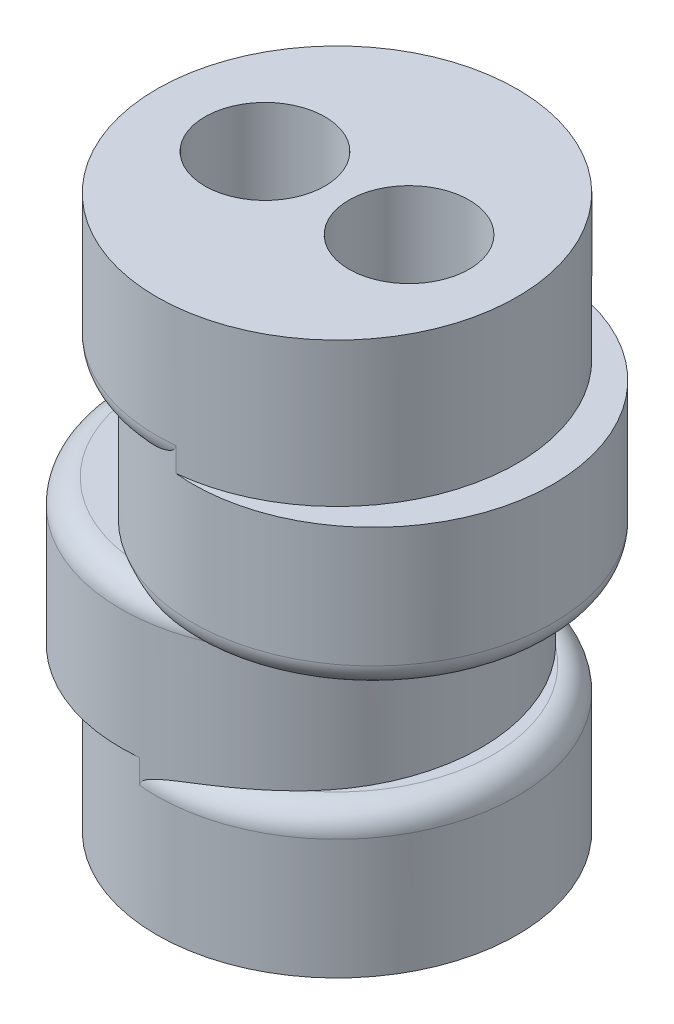
ISO-10303-21;
HEADER;
FILE_DESCRIPTION(('STEP AP214'),'2;1');
FILE_NAME('part.step','',(''),(''),'','','');
FILE_SCHEMA(('AUTOMOTIVE_DESIGN { 1 0 10303 214 1 1 1 1 }'));
ENDSEC;
DATA;
#1=APPLICATION_CONTEXT('core data for automotive mechanical design processes');
#2=APPLICATION_PROTOCOL_DEFINITION('international standard','automotive_design',2000,#1);
#3=PRODUCT_CONTEXT('',#1,'mechanical');
#4=PRODUCT('Part','Part','',(#3));
#5=PRODUCT_RELATED_PRODUCT_CATEGORY('part','',(#4));
#6=PRODUCT_DEFINITION_FORMATION('','',#4);
#7=PRODUCT_DEFINITION_CONTEXT('part definition',#1,'design');
#8=PRODUCT_DEFINITION('design','',#6,#7);
#9=PRODUCT_DEFINITION_SHAPE('','',#8);
#10=(LENGTH_UNIT() NAMED_UNIT(*) SI_UNIT(.MILLI.,.METRE.));
#11=(NAMED_UNIT(*) PLANE_ANGLE_UNIT() SI_UNIT($,.RADIAN.));
#12=(NAMED_UNIT(*) SI_UNIT($,.STERADIAN.) SOLID_ANGLE_UNIT());
#13=UNCERTAINTY_MEASURE_WITH_UNIT(LENGTH_MEASURE(1.E-05),#10,'distance_accuracy_value','');
#14=(GEOMETRIC_REPRESENTATION_CONTEXT(3) GLOBAL_UNCERTAINTY_ASSIGNED_CONTEXT((#13)) GLOBAL_UNIT_ASSIGNED_CONTEXT((#10,
#11,#12)) REPRESENTATION_CONTEXT('',''));
#15=CARTESIAN_POINT('',(0.,0.,0.));
#16=DIRECTION('',(0.,0.,1.));
#17=DIRECTION('',(1.,0.,0.));
#18=AXIS2_PLACEMENT_3D('',#15,#16,#17);
#19=CARTESIAN_POINT('',(0.,1.,0.));
#20=DIRECTION('',(0.,1.,0.));
#21=DIRECTION('',(0.,0.,1.));
#22=AXIS2_PLACEMENT_3D('',#19,#20,#21);
#23=PLANE('',#22);
#24=CARTESIAN_POINT('',(1.5,1.,0.));
#25=DIRECTION('',(0.,1.,0.));
#26=DIRECTION('',(0.,0.,1.));
#27=AXIS2_PLACEMENT_3D('',#24,#25,#26);
#28=CIRCLE('',#27,7.5);
#29=CARTESIAN_POINT('',(-2.33333333333333,1.,-6.44635986860457));
#30=VERTEX_POINT('',#29);
#31=CARTESIAN_POINT('',(-2.33333333333334,1.,6.44635986860457));
#32=VERTEX_POINT('',#31);
#33=EDGE_CURVE('E114',#30,#32,#28,.T.);
#34=ORIENTED_EDGE('',*,*,#33,.F.);
#35=CARTESIAN_POINT('',(-1.5,1.,0.));
#36=DIRECTION('',(0.,1.,0.));
#37=DIRECTION('',(0.,0.,1.));
#38=AXIS2_PLACEMENT_3D('',#35,#36,#37);
#39=CIRCLE('',#38,6.5);
#40=EDGE_CURVE('E124',#30,#32,#39,.T.);
#41=ORIENTED_EDGE('',*,*,#40,.T.);
#42=EDGE_LOOP('',(#34,#41));
#43=FACE_BOUND('',#42,.T.);
#44=ADVANCED_FACE('F43',(#43),#23,.T.);
#45=CARTESIAN_POINT('',(1.5,6.,0.));
#46=DIRECTION('',(0.,-1.,0.));
#47=DIRECTION('',(0.,0.,-1.));
#48=AXIS2_PLACEMENT_3D('',#45,#46,#47);
#49=CYLINDRICAL_SURFACE('',#48,7.5);
#50=CARTESIAN_POINT('',(1.5,6.,0.));
#51=DIRECTION('',(0.,1.,0.));
#52=DIRECTION('',(0.,0.,1.));
#53=AXIS2_PLACEMENT_3D('',#50,#51,#52);
#54=CIRCLE('',#53,7.5);
#55=CARTESIAN_POINT('',(-3.91666666666667,6.,-5.18745816582863));
#56=VERTEX_POINT('',#55);
#57=CARTESIAN_POINT('',(-3.91666666666667,6.,5.18745816582863));
#58=VERTEX_POINT('',#57);
#59=EDGE_CURVE('E126',#56,#58,#54,.T.);
#60=ORIENTED_EDGE('',*,*,#59,.F.);
#61=CARTESIAN_POINT('',(-3.91666666666667,6.,-5.18745816582863));
#62=CARTESIAN_POINT('',(-3.80020965298497,6.00000376623683,-5.30907745682028));
#63=CARTESIAN_POINT('',(-3.67963772504321,6.00108425668644,-5.42676221345615));
#64=CARTESIAN_POINT('',(-3.4308604372146,6.00579596257565,-5.65375342871365));
#65=CARTESIAN_POINT('',(-3.30265380357124,6.00942760474079,-5.76305848228776));
#66=CARTESIAN_POINT('',(-3.03857688571664,6.01966497350277,-5.97327016206557));
#67=CARTESIAN_POINT('',(-2.90267112692783,6.02628564632135,-6.074131524888));
#68=CARTESIAN_POINT('',(-2.62450920628984,6.04296113263224,-6.26633830271847));
#69=CARTESIAN_POINT('',(-2.48225373346395,6.05301557430147,-6.35768474664537));
#70=CARTESIAN_POINT('',(-2.19201443519067,6.07711740261451,-6.53051171759557));
#71=CARTESIAN_POINT('',(-2.04402547613502,6.09116844257409,-6.61198312015529));
#72=CARTESIAN_POINT('',(-1.7432570506047,6.12397818330012,-6.76459326921122));
#73=CARTESIAN_POINT('',(-1.59047632801145,6.14273812764413,-6.83572927837934));
#74=CARTESIAN_POINT('',(-1.28167539426653,6.18593141537546,-6.96709052071892));
#75=CARTESIAN_POINT('',(-1.12566746598823,6.21034592950186,-7.02735080959187));
#76=CARTESIAN_POINT('',(-0.811208030710873,6.26646658636996,-7.13694445746253));
#77=CARTESIAN_POINT('',(-0.652758445892802,6.29816724188823,-7.186285984813));
#78=CARTESIAN_POINT('',(-0.420906466500022,6.35210082719847,-7.25023370801776));
#79=CARTESIAN_POINT('',(-0.347730652853794,6.37021733834268,-7.26922016067236));
#80=CARTESIAN_POINT('',(-0.201572565759272,6.40923541251192,-7.30481314091101));
#81=CARTESIAN_POINT('',(-0.12859020419728,6.43013534176396,-7.32142105284015));
#82=CARTESIAN_POINT('',(-0.00523888297090668,6.46872045224718,-7.34758084829485));
#83=CARTESIAN_POINT('',(0.0452936294616805,6.48546620764322,-7.35774763888258));
#84=CARTESIAN_POINT('',(0.145777049732081,6.52121136616641,-7.3769025460988));
#85=CARTESIAN_POINT('',(0.195728147423861,6.54021000959945,-7.38589105791297));
#86=CARTESIAN_POINT('',(0.292551650967351,6.5803548726076,-7.40232268605764));
#87=CARTESIAN_POINT('',(0.339465887243796,6.60137957306734,-7.40981438583232));
#88=CARTESIAN_POINT('',(0.431592455582759,6.64725385341274,-7.42365517215394));
#89=CARTESIAN_POINT('',(0.476806590617029,6.67209923040398,-7.43000549780786));
#90=CARTESIAN_POINT('',(0.543212037994136,6.71459715050666,-7.43875664565825));
#91=CARTESIAN_POINT('',(0.565690108693779,6.73012785380337,-7.44160917944584));
#92=CARTESIAN_POINT('',(0.609054208703472,6.76339299717483,-7.44692472083518));
#93=CARTESIAN_POINT('',(0.629940714335985,6.78112677370304,-7.44938784521816));
#94=CARTESIAN_POINT('',(0.66287298456048,6.81354047508802,-7.45314719094539));
#95=CARTESIAN_POINT('',(0.675648319407143,6.82745542569204,-7.45456810646068));
#96=CARTESIAN_POINT('',(0.699170787590578,6.85694899111191,-7.45713156426466));
#97=CARTESIAN_POINT('',(0.709921871752992,6.87252427029394,-7.45827465010285));
#98=CARTESIAN_POINT('',(0.725358794780123,6.90019071807877,-7.45989083400088));
#99=CARTESIAN_POINT('',(0.730884638625262,6.91180219183627,-7.46046127899173));
#100=CARTESIAN_POINT('',(0.740027558581135,6.93574811465664,-7.46139820668603));
#101=CARTESIAN_POINT('',(0.743650811839134,6.94808007774894,-7.46176534966521));
#102=CARTESIAN_POINT('',(0.747399345858202,6.96710387040428,-7.46214405337588));
#103=CARTESIAN_POINT('',(0.748368871042657,6.97363359720126,-7.46224171047334));
#104=CARTESIAN_POINT('',(0.749671499278991,6.98677382505067,-7.46237276621829));
#105=CARTESIAN_POINT('',(0.750002925466697,6.99338449311085,-7.46240599555728));
#106=CARTESIAN_POINT('',(0.749999999999993,7.,-7.46240577829976));
#107=B_SPLINE_CURVE_WITH_KNOTS('',3,(#61,#62,#63,#64,#65,#66,#67,#68,#69,#70,#71,#72,#73,#74,
#75,#76,#77,#78,#79,#80,#81,#82,#83,#84,#85,#86,#87,#88,#89,#90,#91,#92,#93,#94,#95,#96,#97,#98,
#99,#100,#101,#102,#103,#104,#105,#106),.UNSPECIFIED.,.F.,.F.,(4,2,2,2,2,2,2,2,2,2,2,2,2,2,2,2,
2,2,2,2,2,2,4),(0.,0.505062255120316,1.01020901101779,1.51791014782438,2.02555632601417,
2.53366804638759,3.04191409574927,3.54849145973945,4.05468856105465,4.28784439163478,
4.52086396582719,4.68340962729234,4.84590063193817,5.00166247624181,5.15725418616227,
5.23958196319817,5.32188500366811,5.37859702517834,5.43519718498234,5.47368789833394,
5.51205285878407,5.53183036461231,5.55165977330438),.UNSPECIFIED.);
#108=CARTESIAN_POINT('',(0.749999999999996,7.,-7.46240577829965));
#109=VERTEX_POINT('',#108);
#110=EDGE_CURVE('E180',#56,#109,#107,.T.);
#111=ORIENTED_EDGE('',*,*,#110,.T.);
#112=DIRECTION('',(0.,-1.,0.));
#113=VECTOR('',#112,1.);
#114=CARTESIAN_POINT('',(0.749999999999996,6.,-7.46240577829965));
#115=LINE('',#114,#113);
#116=CARTESIAN_POINT('',(0.749999999999996,6.,-7.46240577829965));
#117=VERTEX_POINT('',#116);
#118=EDGE_CURVE('E137',#117,#109,#115,.F.);
#119=ORIENTED_EDGE('',*,*,#118,.F.);
#120=CARTESIAN_POINT('',(0.749999999999996,6.,7.46240577829965));
#121=VERTEX_POINT('',#120);
#122=EDGE_CURVE('E224',#121,#117,#54,.T.);
#123=ORIENTED_EDGE('',*,*,#122,.F.);
#124=DIRECTION('',(0.,-1.,0.));
#125=VECTOR('',#124,1.);
#126=CARTESIAN_POINT('',(0.749999999999996,7.,7.46240577829965));
#127=LINE('',#126,#125);
#128=CARTESIAN_POINT('',(0.749999999999996,7.,7.46240577829965));
#129=VERTEX_POINT('',#128);
#130=EDGE_CURVE('E219',#129,#121,#127,.T.);
#131=ORIENTED_EDGE('',*,*,#130,.F.);
#132=CARTESIAN_POINT('',(0.749999999999996,7.,7.46240577829965));
#133=CARTESIAN_POINT('',(0.750036019482423,6.98768932188069,7.46240858779575));
#134=CARTESIAN_POINT('',(0.748864907845315,6.97542836613851,7.46229174037365));
#135=CARTESIAN_POINT('',(0.744449600849435,6.95144863789059,7.46184638454914));
#136=CARTESIAN_POINT('',(0.741232817086053,6.93972486130516,7.46152067439013));
#137=CARTESIAN_POINT('',(0.731789701152738,6.91340717841082,7.46055493361893));
#138=CARTESIAN_POINT('',(0.724941054314432,6.89904368994116,7.45984893177615));
#139=CARTESIAN_POINT('',(0.70907200046839,6.87152552217409,7.4581832747781));
#140=CARTESIAN_POINT('',(0.70003888331614,6.85837856401737,7.4572221317859));
#141=CARTESIAN_POINT('',(0.672769264161954,6.82335194120346,7.45426009423984));
#142=CARTESIAN_POINT('',(0.652900834498436,6.80278125236648,7.45203775657896));
#143=CARTESIAN_POINT('',(0.61065685982178,6.76454143185731,7.44711551322688));
#144=CARTESIAN_POINT('',(0.588275404376113,6.74687939211076,7.44441447266344));
#145=CARTESIAN_POINT('',(0.528610154578932,6.70404836596634,7.43691801358863));
#146=CARTESIAN_POINT('',(0.490226294690102,6.68048347691626,7.43181781775912));
#147=CARTESIAN_POINT('',(0.411613003473146,6.63685628307404,7.42071468483683));
#148=CARTESIAN_POINT('',(0.371379380986006,6.61680248296643,7.41470961959176));
#149=CARTESIAN_POINT('',(0.289661294193137,6.57915123944664,7.40181052893364));
#150=CARTESIAN_POINT('',(0.248171308973287,6.5615674481193,7.39491193905075));
#151=CARTESIAN_POINT('',(0.164616128968209,6.52838421448956,7.38028116134549));
#152=CARTESIAN_POINT('',(0.122551602447707,6.51278265356899,7.37254988012521));
#153=CARTESIAN_POINT('',(0.0119150730710967,6.4739591647081,7.35122075828593));
#154=CARTESIAN_POINT('',(-0.0569667792543377,6.45198935209197,7.33695106064973));
#155=CARTESIAN_POINT('',(-0.195147474584635,6.4110380131887,7.30626419042599));
#156=CARTESIAN_POINT('',(-0.264446476427024,6.39205771121021,7.28984614302765));
#157=CARTESIAN_POINT('',(-0.472641578898537,6.3385628275698,7.23734504048204));
#158=CARTESIAN_POINT('',(-0.611642187400639,6.30755715980983,7.19805200278103));
#159=CARTESIAN_POINT('',(-0.888238050376488,6.25202987076969,7.11107368128666));
#160=CARTESIAN_POINT('',(-1.0258333735579,6.22750793101188,7.06338880988791));
#161=CARTESIAN_POINT('',(-1.2986040208593,6.18350714460653,6.95981932665844));
#162=CARTESIAN_POINT('',(-1.43378092411331,6.16402488636892,6.90394030218513));
#163=CARTESIAN_POINT('',(-1.7486646332577,6.12293676049248,6.76281050571334));
#164=CARTESIAN_POINT('',(-1.92709234595917,6.1030439819635,6.67418526728801));
#165=CARTESIAN_POINT('',(-2.2768365560345,6.06929161782035,6.48269158112197));
#166=CARTESIAN_POINT('',(-2.44814889342681,6.05543551783484,6.37981494956751));
#167=CARTESIAN_POINT('',(-2.78196239366293,6.03279059830429,6.16073002643345));
#168=CARTESIAN_POINT('',(-2.94447755328891,6.02399350129286,6.04454388743313));
#169=CARTESIAN_POINT('',(-3.25974024293427,6.01065483432667,5.79954218078066));
#170=CARTESIAN_POINT('',(-3.41249395190806,6.00611054699621,5.67073473585044));
#171=CARTESIAN_POINT('',(-3.6212702548127,6.00220428186261,5.47992009148906));
#172=CARTESIAN_POINT('',(-3.68175680686078,6.00136558665078,5.42275982968774));
#173=CARTESIAN_POINT('',(-3.80071298276317,6.00026392263928,5.30653777701674));
#174=CARTESIAN_POINT('',(-3.8591853377709,6.00000014139165,5.24747878936676));
#175=CARTESIAN_POINT('',(-3.91666666666667,6.,5.18745816582863));
#176=B_SPLINE_CURVE_WITH_KNOTS('',3,(#132,#133,#134,#135,#136,#137,#138,#139,#140,#141,#142,
#143,#144,#145,#146,#147,#148,#149,#150,#151,#152,#153,#154,#155,#156,#157,#158,#159,#160,#161,
#162,#163,#164,#165,#166,#167,#168,#169,#170,#171,#172,#173,#174,#175),.UNSPECIFIED.,.F.,.F.,(4,
2,2,2,2,2,2,2,2,2,2,2,2,2,2,2,2,2,2,2,2,4),(0.,0.0367957490978329,0.0731085429829649,
0.120624455101134,0.168423783228875,0.253995683915516,0.339773233848797,0.475411370943238,
0.611373642032931,0.748060082676455,0.884599180690596,1.10555328151241,1.32659763675717,
1.76930477204746,2.21199015773085,2.65437508061259,3.2542486811862,3.8544681962086,
4.4537028260649,5.05255430695963,5.30219462134304,5.5514819235587),.UNSPECIFIED.);
#177=EDGE_CURVE('E173',#129,#58,#176,.T.);
#178=ORIENTED_EDGE('',*,*,#177,.T.);
#179=EDGE_LOOP('',(#60,#111,#119,#123,#131,#178));
#180=FACE_BOUND('',#179,.T.);
#181=ORIENTED_EDGE('',*,*,#33,.T.);
#182=CARTESIAN_POINT('',(1.5,1.,0.));
#183=DIRECTION('',(0.,1.,0.));
#184=DIRECTION('',(0.,0.,1.));
#185=AXIS2_PLACEMENT_3D('',#182,#183,#184);
#186=CIRCLE('',#185,7.5);
#187=EDGE_CURVE('E111',#32,#30,#186,.T.);
#188=ORIENTED_EDGE('',*,*,#187,.T.);
#189=EDGE_LOOP('',(#181,#188));
#190=FACE_BOUND('',#189,.T.);
#191=ADVANCED_FACE('F113',(#180,#190),#49,.T.);
#192=CARTESIAN_POINT('',(0.,6.,0.));
#193=DIRECTION('',(0.,1.,0.));
#194=DIRECTION('',(0.,0.,1.));
#195=AXIS2_PLACEMENT_3D('',#192,#193,#194);
#196=PLANE('',#195);
#197=CARTESIAN_POINT('',(0.,6.,0.));
#198=DIRECTION('',(0.,1.,0.));
#199=DIRECTION('',(0.,0.,1.));
#200=AXIS2_PLACEMENT_3D('',#197,#198,#199);
#201=CIRCLE('',#200,7.5);
#202=EDGE_CURVE('E216',#121,#117,#201,.T.);
#203=ORIENTED_EDGE('',*,*,#202,.F.);
#204=ORIENTED_EDGE('',*,*,#122,.T.);
#205=EDGE_LOOP('',(#203,#204));
#206=FACE_BOUND('',#205,.T.);
#207=ADVANCED_FACE('F169',(#206),#196,.T.);
#208=CARTESIAN_POINT('',(0.,-5.,0.));
#209=DIRECTION('',(0.,-1.,0.));
#210=DIRECTION('',(0.,0.,-1.));
#211=AXIS2_PLACEMENT_3D('',#208,#209,#210);
#212=PLANE('',#211);
#213=CARTESIAN_POINT('',(-1.5,-5.,0.));
#214=DIRECTION('',(0.,-1.,0.));
#215=DIRECTION('',(0.,0.,-1.));
#216=AXIS2_PLACEMENT_3D('',#213,#214,#215);
#217=CIRCLE('',#216,7.5);
#218=CARTESIAN_POINT('',(-0.750000000000001,-5.,7.46240577829965));
#219=VERTEX_POINT('',#218);
#220=CARTESIAN_POINT('',(-0.749999999999999,-5.,-7.46240577829965));
#221=VERTEX_POINT('',#220);
#222=EDGE_CURVE('E228',#219,#221,#217,.T.);
#223=ORIENTED_EDGE('',*,*,#222,.T.);
#224=CARTESIAN_POINT('',(0.,-5.,0.));
#225=DIRECTION('',(0.,1.,0.));
#226=DIRECTION('',(0.,0.,1.));
#227=AXIS2_PLACEMENT_3D('',#224,#225,#226);
#228=CIRCLE('',#227,7.5);
#229=EDGE_CURVE('E262',#221,#219,#228,.T.);
#230=ORIENTED_EDGE('',*,*,#229,.T.);
#231=EDGE_LOOP('',(#223,#230));
#232=FACE_BOUND('',#231,.T.);
#233=ADVANCED_FACE('F237',(#232),#212,.T.);
#234=CARTESIAN_POINT('',(-1.5,-5.,0.));
#235=DIRECTION('',(0.,1.,0.));
#236=DIRECTION('',(0.,0.,1.));
#237=AXIS2_PLACEMENT_3D('',#234,#235,#236);
#238=CYLINDRICAL_SURFACE('',#237,7.5);
#239=CARTESIAN_POINT('',(3.91666666666667,-5.,-5.18745816582864));
#240=VERTEX_POINT('',#239);
#241=CARTESIAN_POINT('',(3.91666666666667,-5.,5.18745816582864));
#242=VERTEX_POINT('',#241);
#243=EDGE_CURVE('E225',#240,#242,#217,.T.);
#244=ORIENTED_EDGE('',*,*,#243,.F.);
#245=CARTESIAN_POINT('',(3.91666666666667,-5.,-5.18745816582864));
#246=CARTESIAN_POINT('',(3.80020965298496,-5.00000376623683,-5.30907745682028));
#247=CARTESIAN_POINT('',(3.67963772504321,-5.00108425668644,-5.42676221345615));
#248=CARTESIAN_POINT('',(3.43086043721459,-5.00579596257565,-5.65375342871366));
#249=CARTESIAN_POINT('',(3.30265380357123,-5.00942760474079,-5.76305848228776));
#250=CARTESIAN_POINT('',(3.03857688571663,-5.01966497350277,-5.97327016206557));
#251=CARTESIAN_POINT('',(2.90267112692783,-5.02628564632135,-6.074131524888));
#252=CARTESIAN_POINT('',(2.62450920628984,-5.04296113263224,-6.26633830271847));
#253=CARTESIAN_POINT('',(2.48225373346395,-5.05301557430147,-6.35768474664537));
#254=CARTESIAN_POINT('',(2.19201443519067,-5.07711740261451,-6.53051171759557));
#255=CARTESIAN_POINT('',(2.04402547613501,-5.09116844257409,-6.6119831201553));
#256=CARTESIAN_POINT('',(1.74325705060469,-5.12397818330012,-6.76459326921122));
#257=CARTESIAN_POINT('',(1.59047632801145,-5.14273812764413,-6.83572927837934));
#258=CARTESIAN_POINT('',(1.28167539426652,-5.18593141537546,-6.96709052071892));
#259=CARTESIAN_POINT('',(1.12566746598822,-5.21034592950186,-7.02735080959188));
#260=CARTESIAN_POINT('',(0.811208030710867,-5.26646658636996,-7.13694445746253));
#261=CARTESIAN_POINT('',(0.652758445892796,-5.29816724188823,-7.186285984813));
#262=CARTESIAN_POINT('',(0.420906466500016,-5.35210082719847,-7.25023370801776));
#263=CARTESIAN_POINT('',(0.347730652853788,-5.37021733834268,-7.26922016067236));
#264=CARTESIAN_POINT('',(0.201572565759266,-5.40923541251192,-7.30481314091101));
#265=CARTESIAN_POINT('',(0.128590204197275,-5.43013534176396,-7.32142105284015));
#266=CARTESIAN_POINT('',(0.00523888297090113,-5.46872045224718,-7.34758084829485));
#267=CARTESIAN_POINT('',(-0.0452936294616863,-5.48546620764322,-7.35774763888258));
#268=CARTESIAN_POINT('',(-0.145777049732088,-5.52121136616641,-7.3769025460988));
#269=CARTESIAN_POINT('',(-0.195728147423869,-5.54021000959945,-7.38589105791297));
#270=CARTESIAN_POINT('',(-0.292551650967359,-5.5803548726076,-7.40232268605764));
#271=CARTESIAN_POINT('',(-0.339465887243802,-5.60137957306734,-7.40981438583232));
#272=CARTESIAN_POINT('',(-0.431592455582762,-5.64725385341274,-7.42365517215394));
#273=CARTESIAN_POINT('',(-0.476806590617031,-5.67209923040398,-7.43000549780786));
#274=CARTESIAN_POINT('',(-0.543212037994139,-5.71459715050666,-7.43875664565825));
#275=CARTESIAN_POINT('',(-0.565690108693783,-5.73012785380337,-7.44160917944584));
#276=CARTESIAN_POINT('',(-0.609054208703479,-5.76339299717483,-7.44692472083518));
#277=CARTESIAN_POINT('',(-0.629940714335994,-5.78112677370304,-7.44938784521816));
#278=CARTESIAN_POINT('',(-0.662872984560487,-5.81354047508802,-7.45314719094539));
#279=CARTESIAN_POINT('',(-0.675648319407148,-5.82745542569204,-7.45456810646068));
#280=CARTESIAN_POINT('',(-0.699170787590581,-5.85694899111191,-7.45713156426466));
#281=CARTESIAN_POINT('',(-0.709921871752995,-5.87252427029394,-7.45827465010285));
#282=CARTESIAN_POINT('',(-0.725358794780124,-5.90019071807877,-7.45989083400088));
#283=CARTESIAN_POINT('',(-0.730884638625261,-5.91180219183627,-7.46046127899173));
#284=CARTESIAN_POINT('',(-0.740027558581138,-5.93574811465664,-7.46139820668603));
#285=CARTESIAN_POINT('',(-0.743650811839144,-5.94808007774893,-7.4617653496652));
#286=CARTESIAN_POINT('',(-0.74739934585821,-5.96710387040428,-7.46214405337588));
#287=CARTESIAN_POINT('',(-0.748368871042662,-5.97363359720126,-7.46224171047334));
#288=CARTESIAN_POINT('',(-0.749671499278993,-5.98677382505067,-7.46237276621829));
#289=CARTESIAN_POINT('',(-0.750002925466698,-5.99338449311085,-7.46240599555729));
#290=CARTESIAN_POINT('',(-0.749999999999997,-6.,-7.46240577829976));
#291=B_SPLINE_CURVE_WITH_KNOTS('',3,(#245,#246,#247,#248,#249,#250,#251,#252,#253,#254,#255,
#256,#257,#258,#259,#260,#261,#262,#263,#264,#265,#266,#267,#268,#269,#270,#271,#272,#273,#274,
#275,#276,#277,#278,#279,#280,#281,#282,#283,#284,#285,#286,#287,#288,#289,#290),.UNSPECIFIED.,
.F.,.F.,(4,2,2,2,2,2,2,2,2,2,2,2,2,2,2,2,2,2,2,2,2,2,4),(0.,0.505062255120316,1.01020901101779,
1.51791014782438,2.02555632601417,2.53366804638759,3.04191409574927,3.54849145973945,
4.05468856105465,4.28784439163478,4.52086396582719,4.68340962729234,4.84590063193817,
5.00166247624181,5.15725418616227,5.23958196319817,5.32188500366812,5.37859702517833,
5.43519718498234,5.47368789833394,5.51205285878406,5.53183036461231,5.55165977330438),.UNSPECIFIED.);
#292=CARTESIAN_POINT('',(-0.749999999999999,-6.,-7.46240577829965));
#293=VERTEX_POINT('',#292);
#294=EDGE_CURVE('E57',#240,#293,#291,.T.);
#295=ORIENTED_EDGE('',*,*,#294,.T.);
#296=DIRECTION('',(0.,1.,0.));
#297=VECTOR('',#296,1.);
#298=CARTESIAN_POINT('',(-0.749999999999999,-5.,-7.46240577829965));
#299=LINE('',#298,#297);
#300=EDGE_CURVE('E64',#221,#293,#299,.F.);
#301=ORIENTED_EDGE('',*,*,#300,.F.);
#302=ORIENTED_EDGE('',*,*,#222,.F.);
#303=DIRECTION('',(0.,1.,0.));
#304=VECTOR('',#303,1.);
#305=CARTESIAN_POINT('',(-0.750000000000001,-6.,7.46240577829965));
#306=LINE('',#305,#304);
#307=CARTESIAN_POINT('',(-0.750000000000001,-6.,7.46240577829965));
#308=VERTEX_POINT('',#307);
#309=EDGE_CURVE('E254',#308,#219,#306,.T.);
#310=ORIENTED_EDGE('',*,*,#309,.F.);
#311=CARTESIAN_POINT('',(-0.750000000000001,-6.,7.46240577829965));
#312=CARTESIAN_POINT('',(-0.750036019482428,-5.98768932188069,7.46240858779575));
#313=CARTESIAN_POINT('',(-0.748864907845321,-5.97542836613851,7.46229174037365));
#314=CARTESIAN_POINT('',(-0.744449600849441,-5.95144863789059,7.46184638454914));
#315=CARTESIAN_POINT('',(-0.741232817086058,-5.93972486130516,7.46152067439013));
#316=CARTESIAN_POINT('',(-0.731789701152743,-5.91340717841082,7.46055493361893));
#317=CARTESIAN_POINT('',(-0.724941054314437,-5.89904368994116,7.45984893177615));
#318=CARTESIAN_POINT('',(-0.709072000468395,-5.87152552217409,7.4581832747781));
#319=CARTESIAN_POINT('',(-0.700038883316144,-5.85837856401737,7.4572221317859));
#320=CARTESIAN_POINT('',(-0.672769264161958,-5.82335194120346,7.45426009423984));
#321=CARTESIAN_POINT('',(-0.652900834498441,-5.80278125236648,7.45203775657896));
#322=CARTESIAN_POINT('',(-0.610656859821786,-5.76454143185732,7.44711551322688));
#323=CARTESIAN_POINT('',(-0.588275404376119,-5.74687939211076,7.44441447266344));
#324=CARTESIAN_POINT('',(-0.528610154578938,-5.70404836596634,7.43691801358863));
#325=CARTESIAN_POINT('',(-0.490226294690111,-5.68048347691626,7.43181781775912));
#326=CARTESIAN_POINT('',(-0.411613003473157,-5.63685628307405,7.42071468483683));
#327=CARTESIAN_POINT('',(-0.371379380986018,-5.61680248296644,7.41470961959176));
#328=CARTESIAN_POINT('',(-0.28966129419315,-5.57915123944664,7.40181052893364));
#329=CARTESIAN_POINT('',(-0.248171308973301,-5.56156744811931,7.39491193905075));
#330=CARTESIAN_POINT('',(-0.164616128968225,-5.52838421448957,7.38028116134549));
#331=CARTESIAN_POINT('',(-0.122551602447725,-5.512782653569,7.37254988012522));
#332=CARTESIAN_POINT('',(-0.0119150730711158,-5.47395916470811,7.35122075828593));
#333=CARTESIAN_POINT('',(0.0569667792543178,-5.45198935209197,7.33695106064973));
#334=CARTESIAN_POINT('',(0.195147474584613,-5.41103801318871,7.306264190426));
#335=CARTESIAN_POINT('',(0.264446476427001,-5.39205771121022,7.28984614302766));
#336=CARTESIAN_POINT('',(0.47264157889851,-5.33856282756981,7.23734504048205));
#337=CARTESIAN_POINT('',(0.61164218740061,-5.30755715980983,7.19805200278104));
#338=CARTESIAN_POINT('',(0.888238050376456,-5.2520298707697,7.11107368128667));
#339=CARTESIAN_POINT('',(1.02583337355786,-5.22750793101189,7.06338880988792));
#340=CARTESIAN_POINT('',(1.29860402085926,-5.18350714460653,6.95981932665845));
#341=CARTESIAN_POINT('',(1.43378092411327,-5.16402488636892,6.90394030218514));
#342=CARTESIAN_POINT('',(1.74866463325766,-5.12293676049249,6.76281050571335));
#343=CARTESIAN_POINT('',(1.92709234595913,-5.10304398196351,6.67418526728803));
#344=CARTESIAN_POINT('',(2.27683655603447,-5.06929161782035,6.48269158112199));
#345=CARTESIAN_POINT('',(2.44814889342677,-5.05543551783484,6.37981494956753));
#346=CARTESIAN_POINT('',(2.7819623936629,-5.03279059830429,6.16073002643348));
#347=CARTESIAN_POINT('',(2.94447755328888,-5.02399350129286,6.04454388743315));
#348=CARTESIAN_POINT('',(3.25974024293423,-5.01065483432667,5.79954218078069));
#349=CARTESIAN_POINT('',(3.41249395190802,-5.00611054699621,5.67073473585047));
#350=CARTESIAN_POINT('',(3.62127025481267,-5.00220428186261,5.47992009148909));
#351=CARTESIAN_POINT('',(3.68175680686076,-5.00136558665078,5.42275982968776));
#352=CARTESIAN_POINT('',(3.80071298276315,-5.00026392263928,5.30653777701675));
#353=CARTESIAN_POINT('',(3.85918533777089,-5.00000014139165,5.24747878936677));
#354=CARTESIAN_POINT('',(3.91666666666667,-5.,5.18745816582864));
#355=B_SPLINE_CURVE_WITH_KNOTS('',3,(#311,#312,#313,#314,#315,#316,#317,#318,#319,#320,#321,
#322,#323,#324,#325,#326,#327,#328,#329,#330,#331,#332,#333,#334,#335,#336,#337,#338,#339,#340,
#341,#342,#343,#344,#345,#346,#347,#348,#349,#350,#351,#352,#353,#354),.UNSPECIFIED.,.F.,.F.,(4,
2,2,2,2,2,2,2,2,2,2,2,2,2,2,2,2,2,2,2,2,4),(0.,0.0367957490978329,0.073108542982965,
0.120624455101135,0.168423783228874,0.253995683915511,0.339773233848794,0.475411370943233,
0.611373642032922,0.748060082676443,0.884599180690582,1.1055532815124,1.32659763675715,
1.76930477204743,2.21199015773081,2.65437508061255,3.25424868118616,3.85446819620856,
4.45370282606486,5.05255430695959,5.30219462134302,5.5514819235587),.UNSPECIFIED.);
#356=EDGE_CURVE('E11',#308,#242,#355,.T.);
#357=ORIENTED_EDGE('',*,*,#356,.T.);
#358=EDGE_LOOP('',(#244,#295,#301,#302,#310,#357));
#359=FACE_BOUND('',#358,.T.);
#360=CARTESIAN_POINT('',(-1.5,0.,0.));
#361=DIRECTION('',(0.,1.,0.));
#362=DIRECTION('',(0.,0.,1.));
#363=AXIS2_PLACEMENT_3D('',#360,#361,#362);
#364=CIRCLE('',#363,7.5);
#365=CARTESIAN_POINT('',(2.33333333333333,0.,6.44635986860457));
#366=VERTEX_POINT('',#365);
#367=CARTESIAN_POINT('',(2.33333333333333,0.,-6.44635986860457));
#368=VERTEX_POINT('',#367);
#369=EDGE_CURVE('E133',#366,#368,#364,.F.);
#370=ORIENTED_EDGE('',*,*,#369,.T.);
#371=CARTESIAN_POINT('',(-1.5,0.,0.));
#372=DIRECTION('',(0.,-1.,0.));
#373=DIRECTION('',(0.,0.,-1.));
#374=AXIS2_PLACEMENT_3D('',#371,#372,#373);
#375=CIRCLE('',#374,7.5);
#376=EDGE_CURVE('E125',#368,#366,#375,.T.);
#377=ORIENTED_EDGE('',*,*,#376,.T.);
#378=EDGE_LOOP('',(#370,#377));
#379=FACE_BOUND('',#378,.T.);
#380=ADVANCED_FACE('F162',(#359,#379),#238,.T.);
#381=CARTESIAN_POINT('',(0.,0.,0.));
#382=DIRECTION('',(0.,1.,0.));
#383=DIRECTION('',(0.,0.,1.));
#384=AXIS2_PLACEMENT_3D('',#381,#382,#383);
#385=PLANE('',#384);
#386=ORIENTED_EDGE('',*,*,#376,.F.);
#387=CARTESIAN_POINT('',(1.5,0.,0.));
#388=DIRECTION('',(0.,1.,0.));
#389=DIRECTION('',(0.,0.,1.));
#390=AXIS2_PLACEMENT_3D('',#387,#388,#389);
#391=CIRCLE('',#390,6.5);
#392=EDGE_CURVE('E119',#368,#366,#391,.F.);
#393=ORIENTED_EDGE('',*,*,#392,.T.);
#394=EDGE_LOOP('',(#386,#393));
#395=FACE_BOUND('',#394,.T.);
#396=ADVANCED_FACE('F158',(#395),#385,.F.);
#397=CARTESIAN_POINT('',(-1.5,0.,0.));
#398=DIRECTION('',(0.,1.,0.));
#399=DIRECTION('',(0.,0.,1.));
#400=AXIS2_PLACEMENT_3D('',#397,#398,#399);
#401=TOROIDAL_SURFACE('',#400,6.5,1.);
#402=ORIENTED_EDGE('',*,*,#40,.F.);
#403=CARTESIAN_POINT('',(-2.33333333333334,1.,-6.44635986860457));
#404=CARTESIAN_POINT('',(-2.27847331767754,0.999997195773188,-6.47897787063077));
#405=CARTESIAN_POINT('',(-2.22320663573832,0.999038330044669,-6.51089941451742));
#406=CARTESIAN_POINT('',(-2.11191173275824,0.995167961178484,-6.57328136879057));
#407=CARTESIAN_POINT('',(-2.05588339971443,0.992256167746456,-6.60374156123203));
#408=CARTESIAN_POINT('',(-1.88656977923561,0.98051795485177,-6.69291278830112));
#409=CARTESIAN_POINT('',(-1.77223975494529,0.968688430906163,-6.74930488050192));
#410=CARTESIAN_POINT('',(-1.54130897185533,0.936741870407181,-6.85481193167248));
#411=CARTESIAN_POINT('',(-1.42470692118575,0.916619979575086,-6.90392260522781));
#412=CARTESIAN_POINT('',(-1.18983811249655,0.86821418733996,-6.99315571358349));
#413=CARTESIAN_POINT('',(-1.07157287067378,0.839937312719871,-7.03328583387769));
#414=CARTESIAN_POINT('',(-0.859260158721642,0.783010539900012,-7.09517291283037));
#415=CARTESIAN_POINT('',(-0.765450333383471,0.755737407771511,-7.11902411723486));
#416=CARTESIAN_POINT('',(-0.577266260209572,0.69767176346554,-7.15901562785289));
#417=CARTESIAN_POINT('',(-0.482892034677802,0.666879389501809,-7.17515623676138));
#418=CARTESIAN_POINT('',(-0.294249578312413,0.603231373566753,-7.19891706846092));
#419=CARTESIAN_POINT('',(-0.199982825281866,0.570385776526587,-7.20657579481984));
#420=CARTESIAN_POINT('',(-0.011360325911493,0.504076061160545,-7.2131175181049));
#421=CARTESIAN_POINT('',(0.0829954203492923,0.470611943383521,-7.21200052281791));
#422=CARTESIAN_POINT('',(0.271549666518832,0.404718814924737,-7.20104896867959));
#423=CARTESIAN_POINT('',(0.365748180127548,0.372289709061501,-7.19121521384344));
#424=CARTESIAN_POINT('',(0.553764761173522,0.309978266799758,-7.16332038206975));
#425=CARTESIAN_POINT('',(0.647582817919885,0.280096001501988,-7.14525907553099));
#426=CARTESIAN_POINT('',(0.835011209873375,0.223962739488195,-7.10162459943149));
#427=CARTESIAN_POINT('',(0.928618883845115,0.197728037158944,-7.07601922183741));
#428=CARTESIAN_POINT('',(1.11498830491825,0.149857495039363,-7.01830189267345));
#429=CARTESIAN_POINT('',(1.20775005456166,0.128221641425082,-6.98618996066258));
#430=CARTESIAN_POINT('',(1.38887420555914,0.0906513799310166,-6.91767943885653));
#431=CARTESIAN_POINT('',(1.47727462144584,0.0745395012718422,-6.88147719819883));
#432=CARTESIAN_POINT('',(1.65288944906097,0.0470625717261385,-6.8046506870691));
#433=CARTESIAN_POINT('',(1.74010369594228,0.0356981742264857,-6.76402580888707));
#434=CARTESIAN_POINT('',(1.91264439145025,0.0176928975709398,-6.67917172828686));
#435=CARTESIAN_POINT('',(1.99797859915092,0.0110263113410581,-6.63496364155347));
#436=CARTESIAN_POINT('',(2.16696329883506,0.00218365426049674,-6.54313557457217));
#437=CARTESIAN_POINT('',(2.25061479388218,4.82467879334393E-06,-6.49551770903886));
#438=CARTESIAN_POINT('',(2.33333333333333,0.,-6.44635986860457));
#439=B_SPLINE_CURVE_WITH_KNOTS('',3,(#403,#404,#405,#406,#407,#408,#409,#410,#411,#412,#413,
#414,#415,#416,#417,#418,#419,#420,#421,#422,#423,#424,#425,#426,#427,#428,#429,#430,#431,#432,
#433,#434,#435,#436,#437,#438),.UNSPECIFIED.,.F.,.F.,(4,2,2,2,2,2,2,2,2,2,2,2,2,2,2,2,2,4),(0.,
0.191447060949852,0.382922585996654,0.766513957066792,1.1503301988481,1.53381670650102,
1.83517652796889,2.13652451797832,2.43649885678228,2.7364729294129,3.0364193359576,
3.33637411343444,3.63762852277597,3.9388820265462,4.22927158276751,4.51970109159939,
4.80852872245659,5.09717875102774),.UNSPECIFIED.);
#440=EDGE_CURVE('E131',#30,#368,#439,.T.);
#441=ORIENTED_EDGE('',*,*,#440,.T.);
#442=ORIENTED_EDGE('',*,*,#369,.F.);
#443=CARTESIAN_POINT('',(2.33333333333333,0.,6.44635986860457));
#444=CARTESIAN_POINT('',(2.27847331767754,2.80422681160662E-06,6.47897787063078));
#445=CARTESIAN_POINT('',(2.22320663573832,0.000961669955331216,6.51089941451742));
#446=CARTESIAN_POINT('',(2.11191173275823,0.00483203882151584,6.57328136879057));
#447=CARTESIAN_POINT('',(2.05588339971442,0.00774383225354381,6.60374156123203));
#448=CARTESIAN_POINT('',(1.88656977923561,0.0194820451482307,6.69291278830113));
#449=CARTESIAN_POINT('',(1.77223975494529,0.0313115690938375,6.74930488050192));
#450=CARTESIAN_POINT('',(1.54130897185532,0.0632581295928193,6.85481193167248));
#451=CARTESIAN_POINT('',(1.42470692118575,0.0833800204249146,6.90392260522781));
#452=CARTESIAN_POINT('',(1.18983811249654,0.13178581266004,6.99315571358349));
#453=CARTESIAN_POINT('',(1.07157287067378,0.160062687280128,7.03328583387769));
#454=CARTESIAN_POINT('',(0.859260158721636,0.216989460099987,7.09517291283037));
#455=CARTESIAN_POINT('',(0.765450333383466,0.244262592228488,7.11902411723486));
#456=CARTESIAN_POINT('',(0.577266260209567,0.30232823653446,7.1590156278529));
#457=CARTESIAN_POINT('',(0.482892034677797,0.333120610498191,7.17515623676138));
#458=CARTESIAN_POINT('',(0.294249578312409,0.396768626433246,7.19891706846092));
#459=CARTESIAN_POINT('',(0.199982825281861,0.429614223473412,7.20657579481985));
#460=CARTESIAN_POINT('',(0.0113603259114895,0.495923938839455,7.2131175181049));
#461=CARTESIAN_POINT('',(-0.0829954203492953,0.529388056616479,7.21200052281791));
#462=CARTESIAN_POINT('',(-0.271549666518834,0.595281185075263,7.20104896867959));
#463=CARTESIAN_POINT('',(-0.365748180127551,0.627710290938498,7.19121521384344));
#464=CARTESIAN_POINT('',(-0.553764761173524,0.69002173320024,7.16332038206975));
#465=CARTESIAN_POINT('',(-0.647582817919886,0.719903998498012,7.14525907553099));
#466=CARTESIAN_POINT('',(-0.835011209873376,0.776037260511804,7.10162459943149));
#467=CARTESIAN_POINT('',(-0.928618883845116,0.802271962841055,7.07601922183741));
#468=CARTESIAN_POINT('',(-1.11498830491825,0.850142504960635,7.01830189267345));
#469=CARTESIAN_POINT('',(-1.20775005456166,0.871778358574917,6.98618996066258));
#470=CARTESIAN_POINT('',(-1.38887420555914,0.909348620068983,6.91767943885653));
#471=CARTESIAN_POINT('',(-1.47727462144584,0.925460498728157,6.88147719819883));
#472=CARTESIAN_POINT('',(-1.65288944906097,0.952937428273861,6.8046506870691));
#473=CARTESIAN_POINT('',(-1.74010369594228,0.964301825773514,6.76402580888707));
#474=CARTESIAN_POINT('',(-1.91264439145026,0.98230710242906,6.67917172828686));
#475=CARTESIAN_POINT('',(-1.99797859915092,0.988973688658942,6.63496364155347));
#476=CARTESIAN_POINT('',(-2.16696329883506,0.997816345739503,6.54313557457217));
#477=CARTESIAN_POINT('',(-2.25061479388219,0.999995175321207,6.49551770903886));
#478=CARTESIAN_POINT('',(-2.33333333333334,1.,6.44635986860457));
#479=B_SPLINE_CURVE_WITH_KNOTS('',3,(#443,#444,#445,#446,#447,#448,#449,#450,#451,#452,#453,
#454,#455,#456,#457,#458,#459,#460,#461,#462,#463,#464,#465,#466,#467,#468,#469,#470,#471,#472,
#473,#474,#475,#476,#477,#478),.UNSPECIFIED.,.F.,.F.,(4,2,2,2,2,2,2,2,2,2,2,2,2,2,2,2,2,4),(0.,
0.191447060949853,0.382922585996655,0.766513957066792,1.1503301988481,1.53381670650102,
1.83517652796889,2.13652451797832,2.43649885678228,2.7364729294129,3.0364193359576,
3.33637411343443,3.63762852277596,3.9388820265462,4.22927158276751,4.51970109159939,
4.80852872245659,5.09717875102774),.UNSPECIFIED.);
#480=EDGE_CURVE('E118',#366,#32,#479,.T.);
#481=ORIENTED_EDGE('',*,*,#480,.T.);
#482=EDGE_LOOP('',(#402,#441,#442,#481));
#483=FACE_BOUND('',#482,.T.);
#484=ADVANCED_FACE('F130',(#483),#401,.T.);
#485=CARTESIAN_POINT('',(1.5,1.,0.));
#486=DIRECTION('',(0.,1.,0.));
#487=DIRECTION('',(0.,0.,1.));
#488=AXIS2_PLACEMENT_3D('',#485,#486,#487);
#489=TOROIDAL_SURFACE('',#488,6.5,1.);
#490=ORIENTED_EDGE('',*,*,#440,.F.);
#491=ORIENTED_EDGE('',*,*,#187,.F.);
#492=ORIENTED_EDGE('',*,*,#480,.F.);
#493=ORIENTED_EDGE('',*,*,#392,.F.);
#494=EDGE_LOOP('',(#490,#491,#492,#493));
#495=FACE_BOUND('',#494,.T.);
#496=ADVANCED_FACE('F135',(#495),#489,.T.);
#497=CARTESIAN_POINT('',(0.,6.,0.));
#498=DIRECTION('',(0.,1.,0.));
#499=DIRECTION('',(0.,0.,1.));
#500=AXIS2_PLACEMENT_3D('',#497,#498,#499);
#501=PLANE('',#500);
#502=ORIENTED_EDGE('',*,*,#59,.T.);
#503=CARTESIAN_POINT('',(0.,6.,0.));
#504=DIRECTION('',(0.,1.,0.));
#505=DIRECTION('',(0.,0.,1.));
#506=AXIS2_PLACEMENT_3D('',#503,#504,#505);
#507=CIRCLE('',#506,6.5);
#508=EDGE_CURVE('E208',#58,#56,#507,.F.);
#509=ORIENTED_EDGE('',*,*,#508,.T.);
#510=EDGE_LOOP('',(#502,#509));
#511=FACE_BOUND('',#510,.T.);
#512=ADVANCED_FACE('F298',(#511),#501,.F.);
#513=CARTESIAN_POINT('',(0.,12.,0.));
#514=DIRECTION('',(0.,-1.,0.));
#515=DIRECTION('',(0.,0.,-1.));
#516=AXIS2_PLACEMENT_3D('',#513,#514,#515);
#517=CYLINDRICAL_SURFACE('',#516,7.5);
#518=CARTESIAN_POINT('',(0.,12.,0.));
#519=DIRECTION('',(0.,1.,0.));
#520=DIRECTION('',(0.,0.,1.));
#521=AXIS2_PLACEMENT_3D('',#518,#519,#520);
#522=CIRCLE('',#521,7.5);
#523=CARTESIAN_POINT('',(0.,12.,7.5));
#524=VERTEX_POINT('',#523);
#525=EDGE_CURVE('E221',#524,#524,#522,.T.);
#526=ORIENTED_EDGE('',*,*,#525,.F.);
#527=EDGE_LOOP('',(#526));
#528=FACE_BOUND('',#527,.T.);
#529=CARTESIAN_POINT('',(0.,7.,0.));
#530=DIRECTION('',(0.,1.,0.));
#531=DIRECTION('',(0.,0.,1.));
#532=AXIS2_PLACEMENT_3D('',#529,#530,#531);
#533=CIRCLE('',#532,7.5);
#534=EDGE_CURVE('E140',#109,#129,#533,.T.);
#535=ORIENTED_EDGE('',*,*,#534,.T.);
#536=ORIENTED_EDGE('',*,*,#130,.T.);
#537=ORIENTED_EDGE('',*,*,#202,.T.);
#538=ORIENTED_EDGE('',*,*,#118,.T.);
#539=EDGE_LOOP('',(#535,#536,#537,#538));
#540=FACE_BOUND('',#539,.T.);
#541=ADVANCED_FACE('F202',(#528,#540),#517,.T.);
#542=CARTESIAN_POINT('',(0.,12.,0.));
#543=DIRECTION('',(0.,1.,0.));
#544=DIRECTION('',(0.,0.,1.));
#545=AXIS2_PLACEMENT_3D('',#542,#543,#544);
#546=PLANE('',#545);
#547=CARTESIAN_POINT('',(-3.,12.,0.));
#548=DIRECTION('',(0.,1.,0.));
#549=DIRECTION('',(0.,0.,1.));
#550=AXIS2_PLACEMENT_3D('',#547,#548,#549);
#551=CIRCLE('',#550,2.5);
#552=CARTESIAN_POINT('',(-3.,12.,2.5));
#553=VERTEX_POINT('',#552);
#554=EDGE_CURVE('E277',#553,#553,#551,.T.);
#555=ORIENTED_EDGE('',*,*,#554,.F.);
#556=EDGE_LOOP('',(#555));
#557=FACE_BOUND('',#556,.T.);
#558=CARTESIAN_POINT('',(3.,12.,0.));
#559=DIRECTION('',(0.,1.,0.));
#560=DIRECTION('',(0.,0.,1.));
#561=AXIS2_PLACEMENT_3D('',#558,#559,#560);
#562=CIRCLE('',#561,2.5);
#563=CARTESIAN_POINT('',(3.,12.,2.5));
#564=VERTEX_POINT('',#563);
#565=EDGE_CURVE('E271',#564,#564,#562,.T.);
#566=ORIENTED_EDGE('',*,*,#565,.F.);
#567=EDGE_LOOP('',(#566));
#568=FACE_BOUND('',#567,.T.);
#569=ORIENTED_EDGE('',*,*,#525,.T.);
#570=EDGE_LOOP('',(#569));
#571=FACE_BOUND('',#570,.T.);
#572=ADVANCED_FACE('F192',(#557,#568,#571),#546,.T.);
#573=CARTESIAN_POINT('',(0.,7.,0.));
#574=DIRECTION('',(0.,1.,0.));
#575=DIRECTION('',(0.,0.,1.));
#576=AXIS2_PLACEMENT_3D('',#573,#574,#575);
#577=TOROIDAL_SURFACE('',#576,6.5,1.);
#578=ORIENTED_EDGE('',*,*,#110,.F.);
#579=ORIENTED_EDGE('',*,*,#508,.F.);
#580=ORIENTED_EDGE('',*,*,#177,.F.);
#581=ORIENTED_EDGE('',*,*,#534,.F.);
#582=EDGE_LOOP('',(#578,#579,#580,#581));
#583=FACE_BOUND('',#582,.T.);
#584=ADVANCED_FACE('F188',(#583),#577,.T.);
#585=CARTESIAN_POINT('',(0.,-5.,0.));
#586=DIRECTION('',(0.,-1.,0.));
#587=DIRECTION('',(0.,0.,1.));
#588=AXIS2_PLACEMENT_3D('',#585,#586,#587);
#589=PLANE('',#588);
#590=ORIENTED_EDGE('',*,*,#243,.T.);
#591=CARTESIAN_POINT('',(0.,-5.,0.));
#592=DIRECTION('',(0.,-1.,0.));
#593=DIRECTION('',(0.,0.,-1.));
#594=AXIS2_PLACEMENT_3D('',#591,#592,#593);
#595=CIRCLE('',#594,6.5);
#596=EDGE_CURVE('E186',#242,#240,#595,.F.);
#597=ORIENTED_EDGE('',*,*,#596,.T.);
#598=EDGE_LOOP('',(#590,#597));
#599=FACE_BOUND('',#598,.T.);
#600=ADVANCED_FACE('F191',(#599),#589,.F.);
#601=CARTESIAN_POINT('',(0.,-11.,0.));
#602=DIRECTION('',(0.,1.,0.));
#603=DIRECTION('',(0.,0.,1.));
#604=AXIS2_PLACEMENT_3D('',#601,#602,#603);
#605=CYLINDRICAL_SURFACE('',#604,7.5);
#606=CARTESIAN_POINT('',(0.,-11.,0.));
#607=DIRECTION('',(0.,1.,0.));
#608=DIRECTION('',(0.,0.,1.));
#609=AXIS2_PLACEMENT_3D('',#606,#607,#608);
#610=CIRCLE('',#609,7.5);
#611=CARTESIAN_POINT('',(0.,-11.,7.5));
#612=VERTEX_POINT('',#611);
#613=EDGE_CURVE('E222',#612,#612,#610,.T.);
#614=ORIENTED_EDGE('',*,*,#613,.T.);
#615=EDGE_LOOP('',(#614));
#616=FACE_BOUND('',#615,.T.);
#617=ORIENTED_EDGE('',*,*,#229,.F.);
#618=ORIENTED_EDGE('',*,*,#300,.T.);
#619=CARTESIAN_POINT('',(0.,-6.,0.));
#620=DIRECTION('',(0.,-1.,0.));
#621=DIRECTION('',(0.,0.,-1.));
#622=AXIS2_PLACEMENT_3D('',#619,#620,#621);
#623=CIRCLE('',#622,7.5);
#624=EDGE_CURVE('E252',#293,#308,#623,.T.);
#625=ORIENTED_EDGE('',*,*,#624,.T.);
#626=ORIENTED_EDGE('',*,*,#309,.T.);
#627=EDGE_LOOP('',(#617,#618,#625,#626));
#628=FACE_BOUND('',#627,.T.);
#629=ADVANCED_FACE('F199',(#616,#628),#605,.T.);
#630=CARTESIAN_POINT('',(0.,-11.,0.));
#631=DIRECTION('',(0.,-1.,0.));
#632=DIRECTION('',(0.,0.,1.));
#633=AXIS2_PLACEMENT_3D('',#630,#631,#632);
#634=PLANE('',#633);
#635=CARTESIAN_POINT('',(-3.,-11.,0.));
#636=DIRECTION('',(0.,1.,0.));
#637=DIRECTION('',(0.,0.,1.));
#638=AXIS2_PLACEMENT_3D('',#635,#636,#637);
#639=CIRCLE('',#638,2.5);
#640=CARTESIAN_POINT('',(-3.,-11.,2.5));
#641=VERTEX_POINT('',#640);
#642=EDGE_CURVE('E264',#641,#641,#639,.T.);
#643=ORIENTED_EDGE('',*,*,#642,.T.);
#644=EDGE_LOOP('',(#643));
#645=FACE_BOUND('',#644,.T.);
#646=CARTESIAN_POINT('',(3.,-11.,0.));
#647=DIRECTION('',(0.,1.,0.));
#648=DIRECTION('',(0.,0.,1.));
#649=AXIS2_PLACEMENT_3D('',#646,#647,#648);
#650=CIRCLE('',#649,2.5);
#651=CARTESIAN_POINT('',(3.,-11.,2.5));
#652=VERTEX_POINT('',#651);
#653=EDGE_CURVE('E274',#652,#652,#650,.T.);
#654=ORIENTED_EDGE('',*,*,#653,.T.);
#655=EDGE_LOOP('',(#654));
#656=FACE_BOUND('',#655,.T.);
#657=ORIENTED_EDGE('',*,*,#613,.F.);
#658=EDGE_LOOP('',(#657));
#659=FACE_BOUND('',#658,.T.);
#660=ADVANCED_FACE('F283',(#645,#656,#659),#634,.T.);
#661=CARTESIAN_POINT('',(0.,-6.,0.));
#662=DIRECTION('',(0.,-1.,0.));
#663=DIRECTION('',(0.,0.,-1.));
#664=AXIS2_PLACEMENT_3D('',#661,#662,#663);
#665=TOROIDAL_SURFACE('',#664,6.5,1.);
#666=ORIENTED_EDGE('',*,*,#356,.F.);
#667=ORIENTED_EDGE('',*,*,#624,.F.);
#668=ORIENTED_EDGE('',*,*,#294,.F.);
#669=ORIENTED_EDGE('',*,*,#596,.F.);
#670=EDGE_LOOP('',(#666,#667,#668,#669));
#671=FACE_BOUND('',#670,.T.);
#672=ADVANCED_FACE('F45',(#671),#665,.T.);
#673=CARTESIAN_POINT('',(3.,-11.,0.));
#674=DIRECTION('',(0.,1.,0.));
#675=DIRECTION('',(0.,0.,1.));
#676=AXIS2_PLACEMENT_3D('',#673,#674,#675);
#677=CYLINDRICAL_SURFACE('',#676,2.5);
#678=ORIENTED_EDGE('',*,*,#653,.F.);
#679=EDGE_LOOP('',(#678));
#680=FACE_BOUND('',#679,.T.);
#681=ORIENTED_EDGE('',*,*,#565,.T.);
#682=EDGE_LOOP('',(#681));
#683=FACE_BOUND('',#682,.T.);
#684=ADVANCED_FACE('F289',(#680,#683),#677,.F.);
#685=CARTESIAN_POINT('',(-3.,-11.,0.));
#686=DIRECTION('',(0.,1.,0.));
#687=DIRECTION('',(0.,0.,1.));
#688=AXIS2_PLACEMENT_3D('',#685,#686,#687);
#689=CYLINDRICAL_SURFACE('',#688,2.5);
#690=ORIENTED_EDGE('',*,*,#642,.F.);
#691=EDGE_LOOP('',(#690));
#692=FACE_BOUND('',#691,.T.);
#693=ORIENTED_EDGE('',*,*,#554,.T.);
#694=EDGE_LOOP('',(#693));
#695=FACE_BOUND('',#694,.T.);
#696=ADVANCED_FACE('F286',(#692,#695),#689,.F.);
#697=CLOSED_SHELL('',(#44,#191,#207,#233,#380,#396,#484,#496,#512,#541,#572,#584,#600,#629,#660,
#672,#684,#696));
#698=MANIFOLD_SOLID_BREP('B2',#697);
#699=ADVANCED_BREP_SHAPE_REPRESENTATION('',(#18,#698),#14);
#700=SHAPE_DEFINITION_REPRESENTATION(#9,#699);
ENDSEC;
END-ISO-10303-21;
